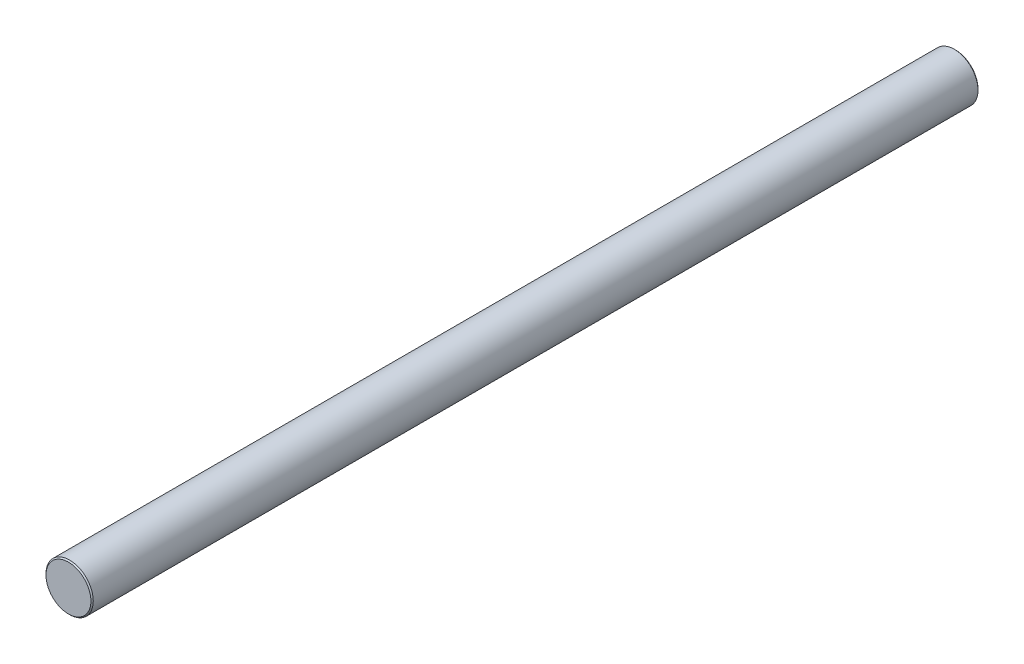
ISO-10303-21;
HEADER;
FILE_DESCRIPTION(('STEP AP214'),'2;1');
FILE_NAME('part.step','',(''),(''),'','','');
FILE_SCHEMA(('AUTOMOTIVE_DESIGN { 1 0 10303 214 1 1 1 1 }'));
ENDSEC;
DATA;
#1=APPLICATION_CONTEXT('core data for automotive mechanical design processes');
#2=APPLICATION_PROTOCOL_DEFINITION('international standard','automotive_design',2000,#1);
#3=PRODUCT_CONTEXT('',#1,'mechanical');
#4=PRODUCT('Part','Part','',(#3));
#5=PRODUCT_RELATED_PRODUCT_CATEGORY('part','',(#4));
#6=PRODUCT_DEFINITION_FORMATION('','',#4);
#7=PRODUCT_DEFINITION_CONTEXT('part definition',#1,'design');
#8=PRODUCT_DEFINITION('design','',#6,#7);
#9=PRODUCT_DEFINITION_SHAPE('','',#8);
#10=(LENGTH_UNIT() NAMED_UNIT(*) SI_UNIT(.MILLI.,.METRE.));
#11=(NAMED_UNIT(*) PLANE_ANGLE_UNIT() SI_UNIT($,.RADIAN.));
#12=(NAMED_UNIT(*) SI_UNIT($,.STERADIAN.) SOLID_ANGLE_UNIT());
#13=UNCERTAINTY_MEASURE_WITH_UNIT(LENGTH_MEASURE(1.E-05),#10,'distance_accuracy_value','');
#14=(GEOMETRIC_REPRESENTATION_CONTEXT(3) GLOBAL_UNCERTAINTY_ASSIGNED_CONTEXT((#13)) GLOBAL_UNIT_ASSIGNED_CONTEXT((#10,
#11,#12)) REPRESENTATION_CONTEXT('',''));
#15=CARTESIAN_POINT('',(0.,0.,0.));
#16=DIRECTION('',(0.,0.,1.));
#17=DIRECTION('',(1.,0.,0.));
#18=AXIS2_PLACEMENT_3D('',#15,#16,#17);
#19=CARTESIAN_POINT('',(0.,0.,150.));
#20=DIRECTION('',(0.,0.,-1.));
#21=DIRECTION('',(-1.,0.,0.));
#22=AXIS2_PLACEMENT_3D('',#19,#20,#21);
#23=CYLINDRICAL_SURFACE('',#22,4.);
#24=CARTESIAN_POINT('',(0.,0.,149.8));
#25=DIRECTION('',(0.,0.,1.));
#26=DIRECTION('',(1.,0.,0.));
#27=AXIS2_PLACEMENT_3D('',#24,#25,#26);
#28=CIRCLE('',#27,4.);
#29=CARTESIAN_POINT('',(4.,0.,149.8));
#30=VERTEX_POINT('',#29);
#31=EDGE_CURVE('E48',#30,#30,#28,.F.);
#32=ORIENTED_EDGE('',*,*,#31,.T.);
#33=EDGE_LOOP('',(#32));
#34=FACE_BOUND('',#33,.T.);
#35=CARTESIAN_POINT('',(0.,0.,0.200000000000033));
#36=DIRECTION('',(0.,0.,1.));
#37=DIRECTION('',(1.,0.,0.));
#38=AXIS2_PLACEMENT_3D('',#35,#36,#37);
#39=CIRCLE('',#38,4.);
#40=CARTESIAN_POINT('',(4.,0.,0.200000000000033));
#41=VERTEX_POINT('',#40);
#42=EDGE_CURVE('E52',#41,#41,#39,.T.);
#43=ORIENTED_EDGE('',*,*,#42,.T.);
#44=EDGE_LOOP('',(#43));
#45=FACE_BOUND('',#44,.T.);
#46=ADVANCED_FACE('F40',(#34,#45),#23,.T.);
#47=CARTESIAN_POINT('',(0.,0.,150.));
#48=DIRECTION('',(0.,0.,1.));
#49=DIRECTION('',(1.,0.,0.));
#50=AXIS2_PLACEMENT_3D('',#47,#48,#49);
#51=PLANE('',#50);
#52=CARTESIAN_POINT('',(0.,0.,150.));
#53=DIRECTION('',(0.,0.,1.));
#54=DIRECTION('',(1.,0.,0.));
#55=AXIS2_PLACEMENT_3D('',#52,#53,#54);
#56=CIRCLE('',#55,3.79999999999996);
#57=CARTESIAN_POINT('',(3.79999999999996,0.,150.));
#58=VERTEX_POINT('',#57);
#59=EDGE_CURVE('E56',#58,#58,#56,.T.);
#60=ORIENTED_EDGE('',*,*,#59,.T.);
#61=EDGE_LOOP('',(#60));
#62=FACE_BOUND('',#61,.T.);
#63=ADVANCED_FACE('F62',(#62),#51,.T.);
#64=CARTESIAN_POINT('',(0.,0.,0.));
#65=DIRECTION('',(0.,0.,1.));
#66=DIRECTION('',(1.,0.,0.));
#67=AXIS2_PLACEMENT_3D('',#64,#65,#66);
#68=PLANE('',#67);
#69=CARTESIAN_POINT('',(0.,0.,0.));
#70=DIRECTION('',(0.,0.,1.));
#71=DIRECTION('',(1.,0.,0.));
#72=AXIS2_PLACEMENT_3D('',#69,#70,#71);
#73=CIRCLE('',#72,3.79999999999998);
#74=CARTESIAN_POINT('',(3.79999999999998,0.,0.));
#75=VERTEX_POINT('',#74);
#76=EDGE_CURVE('E10',#75,#75,#73,.F.);
#77=ORIENTED_EDGE('',*,*,#76,.T.);
#78=EDGE_LOOP('',(#77));
#79=FACE_BOUND('',#78,.T.);
#80=ADVANCED_FACE('F66',(#79),#68,.F.);
#81=CARTESIAN_POINT('',(0.,0.,150.));
#82=DIRECTION('',(0.,0.,-1.));
#83=DIRECTION('',(-1.,0.,0.));
#84=AXIS2_PLACEMENT_3D('',#81,#82,#83);
#85=CONICAL_SURFACE('',#84,3.79999999999996,0.785398163397405);
#86=ORIENTED_EDGE('',*,*,#31,.F.);
#87=EDGE_LOOP('',(#86));
#88=FACE_BOUND('',#87,.T.);
#89=ORIENTED_EDGE('',*,*,#59,.F.);
#90=EDGE_LOOP('',(#89));
#91=FACE_BOUND('',#90,.T.);
#92=ADVANCED_FACE('F64',(#88,#91),#85,.T.);
#93=CARTESIAN_POINT('',(0.,0.,0.200000000000033));
#94=DIRECTION('',(0.,0.,1.));
#95=DIRECTION('',(1.,0.,0.));
#96=AXIS2_PLACEMENT_3D('',#93,#94,#95);
#97=CONICAL_SURFACE('',#96,4.,0.785398163397405);
#98=ORIENTED_EDGE('',*,*,#76,.F.);
#99=EDGE_LOOP('',(#98));
#100=FACE_BOUND('',#99,.T.);
#101=ORIENTED_EDGE('',*,*,#42,.F.);
#102=EDGE_LOOP('',(#101));
#103=FACE_BOUND('',#102,.T.);
#104=ADVANCED_FACE('F43',(#100,#103),#97,.T.);
#105=CLOSED_SHELL('',(#46,#63,#80,#92,#104));
#106=MANIFOLD_SOLID_BREP('B2',#105);
#107=ADVANCED_BREP_SHAPE_REPRESENTATION('',(#18,#106),#14);
#108=SHAPE_DEFINITION_REPRESENTATION(#9,#107);
ENDSEC;
END-ISO-10303-21;
